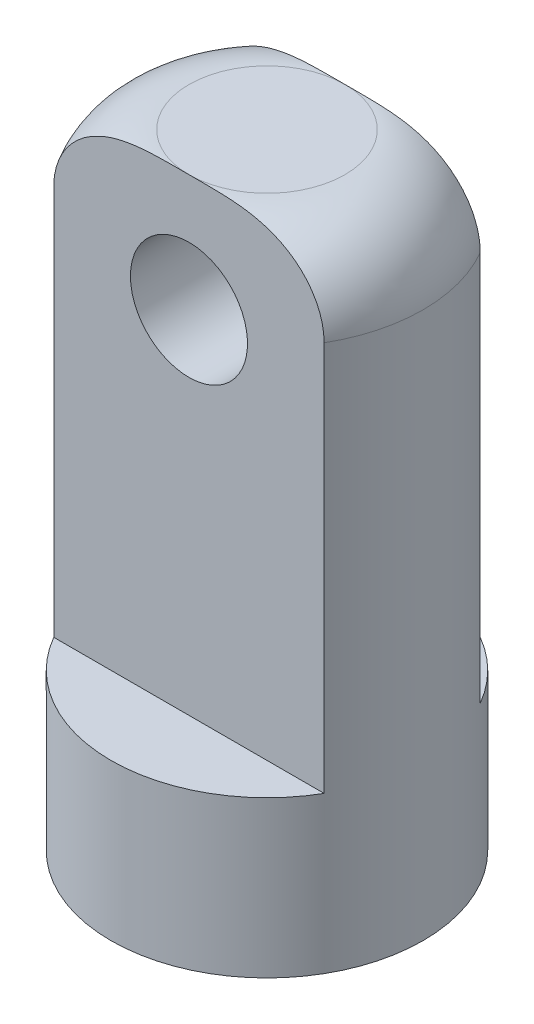
ISO-10303-21;
HEADER;
FILE_DESCRIPTION(('STEP AP214'),'2;1');
FILE_NAME('part.step','',(''),(''),'','','');
FILE_SCHEMA(('AUTOMOTIVE_DESIGN { 1 0 10303 214 1 1 1 1 }'));
ENDSEC;
DATA;
#1=APPLICATION_CONTEXT('core data for automotive mechanical design processes');
#2=APPLICATION_PROTOCOL_DEFINITION('international standard','automotive_design',2000,#1);
#3=PRODUCT_CONTEXT('',#1,'mechanical');
#4=PRODUCT('Part','Part','',(#3));
#5=PRODUCT_RELATED_PRODUCT_CATEGORY('part','',(#4));
#6=PRODUCT_DEFINITION_FORMATION('','',#4);
#7=PRODUCT_DEFINITION_CONTEXT('part definition',#1,'design');
#8=PRODUCT_DEFINITION('design','',#6,#7);
#9=PRODUCT_DEFINITION_SHAPE('','',#8);
#10=(LENGTH_UNIT() NAMED_UNIT(*) SI_UNIT(.MILLI.,.METRE.));
#11=(NAMED_UNIT(*) PLANE_ANGLE_UNIT() SI_UNIT($,.RADIAN.));
#12=(NAMED_UNIT(*) SI_UNIT($,.STERADIAN.) SOLID_ANGLE_UNIT());
#13=UNCERTAINTY_MEASURE_WITH_UNIT(LENGTH_MEASURE(1.E-05),#10,'distance_accuracy_value','');
#14=(GEOMETRIC_REPRESENTATION_CONTEXT(3) GLOBAL_UNCERTAINTY_ASSIGNED_CONTEXT((#13)) GLOBAL_UNIT_ASSIGNED_CONTEXT((#10,
#11,#12)) REPRESENTATION_CONTEXT('',''));
#15=CARTESIAN_POINT('',(0.,0.,0.));
#16=DIRECTION('',(0.,0.,1.));
#17=DIRECTION('',(1.,0.,0.));
#18=AXIS2_PLACEMENT_3D('',#15,#16,#17);
#19=CARTESIAN_POINT('',(0.,80.,0.));
#20=DIRECTION('',(0.,-1.,0.));
#21=DIRECTION('',(0.,0.,-1.));
#22=AXIS2_PLACEMENT_3D('',#19,#20,#21);
#23=CYLINDRICAL_SURFACE('',#22,20.);
#24=CARTESIAN_POINT('',(0.,0.,0.));
#25=DIRECTION('',(0.,1.,0.));
#26=DIRECTION('',(0.,0.,1.));
#27=AXIS2_PLACEMENT_3D('',#24,#25,#26);
#28=CIRCLE('',#27,20.);
#29=CARTESIAN_POINT('',(0.,0.,20.));
#30=VERTEX_POINT('',#29);
#31=EDGE_CURVE('E111',#30,#30,#28,.T.);
#32=ORIENTED_EDGE('',*,*,#31,.T.);
#33=EDGE_LOOP('',(#32));
#34=FACE_BOUND('',#33,.T.);
#35=DIRECTION('',(0.,-1.,0.));
#36=VECTOR('',#35,1.);
#37=CARTESIAN_POINT('',(17.3205080756888,80.,-10.));
#38=LINE('',#37,#36);
#39=CARTESIAN_POINT('',(17.3205080756888,70.,-10.));
#40=VERTEX_POINT('',#39);
#41=CARTESIAN_POINT('',(17.3205080756888,20.,-10.));
#42=VERTEX_POINT('',#41);
#43=EDGE_CURVE('E95',#40,#42,#38,.T.);
#44=ORIENTED_EDGE('',*,*,#43,.F.);
#45=CARTESIAN_POINT('',(0.,70.,0.));
#46=DIRECTION('',(0.,1.,0.));
#47=DIRECTION('',(0.,0.,1.));
#48=AXIS2_PLACEMENT_3D('',#45,#46,#47);
#49=CIRCLE('',#48,20.);
#50=CARTESIAN_POINT('',(17.3205080756888,70.,10.));
#51=VERTEX_POINT('',#50);
#52=EDGE_CURVE('E56',#40,#51,#49,.F.);
#53=ORIENTED_EDGE('',*,*,#52,.T.);
#54=DIRECTION('',(0.,-1.,0.));
#55=VECTOR('',#54,1.);
#56=CARTESIAN_POINT('',(17.3205080756888,80.,10.));
#57=LINE('',#56,#55);
#58=CARTESIAN_POINT('',(17.3205080756888,20.,10.));
#59=VERTEX_POINT('',#58);
#60=EDGE_CURVE('E109',#51,#59,#57,.T.);
#61=ORIENTED_EDGE('',*,*,#60,.T.);
#62=CARTESIAN_POINT('',(0.,20.,0.));
#63=DIRECTION('',(0.,-1.,0.));
#64=DIRECTION('',(0.,0.,-1.));
#65=AXIS2_PLACEMENT_3D('',#62,#63,#64);
#66=CIRCLE('',#65,20.);
#67=CARTESIAN_POINT('',(-17.3205080756888,20.,10.));
#68=VERTEX_POINT('',#67);
#69=EDGE_CURVE('E87',#59,#68,#66,.T.);
#70=ORIENTED_EDGE('',*,*,#69,.T.);
#71=DIRECTION('',(0.,-1.,0.));
#72=VECTOR('',#71,1.);
#73=CARTESIAN_POINT('',(-17.3205080756888,80.,10.));
#74=LINE('',#73,#72);
#75=CARTESIAN_POINT('',(-17.3205080756888,70.,10.));
#76=VERTEX_POINT('',#75);
#77=EDGE_CURVE('E107',#68,#76,#74,.F.);
#78=ORIENTED_EDGE('',*,*,#77,.T.);
#79=CARTESIAN_POINT('',(0.,70.,0.));
#80=DIRECTION('',(0.,1.,0.));
#81=DIRECTION('',(0.,0.,1.));
#82=AXIS2_PLACEMENT_3D('',#79,#80,#81);
#83=CIRCLE('',#82,20.);
#84=CARTESIAN_POINT('',(-17.3205080756888,70.,-10.));
#85=VERTEX_POINT('',#84);
#86=EDGE_CURVE('E99',#76,#85,#83,.F.);
#87=ORIENTED_EDGE('',*,*,#86,.T.);
#88=DIRECTION('',(0.,-1.,0.));
#89=VECTOR('',#88,1.);
#90=CARTESIAN_POINT('',(-17.3205080756888,80.,-10.));
#91=LINE('',#90,#89);
#92=CARTESIAN_POINT('',(-17.3205080756888,20.,-10.));
#93=VERTEX_POINT('',#92);
#94=EDGE_CURVE('E93',#93,#85,#91,.F.);
#95=ORIENTED_EDGE('',*,*,#94,.F.);
#96=CARTESIAN_POINT('',(0.,20.,0.));
#97=DIRECTION('',(0.,1.,0.));
#98=DIRECTION('',(0.,0.,1.));
#99=AXIS2_PLACEMENT_3D('',#96,#97,#98);
#100=CIRCLE('',#99,20.);
#101=EDGE_CURVE('E81',#42,#93,#100,.T.);
#102=ORIENTED_EDGE('',*,*,#101,.F.);
#103=EDGE_LOOP('',(#44,#53,#61,#70,#78,#87,#95,#102));
#104=FACE_BOUND('',#103,.T.);
#105=ADVANCED_FACE('F33',(#34,#104),#23,.T.);
#106=CARTESIAN_POINT('',(0.,80.,0.));
#107=DIRECTION('',(0.,1.,0.));
#108=DIRECTION('',(0.,0.,1.));
#109=AXIS2_PLACEMENT_3D('',#106,#107,#108);
#110=PLANE('',#109);
#111=CARTESIAN_POINT('',(0.,80.,0.));
#112=DIRECTION('',(0.,1.,0.));
#113=DIRECTION('',(0.,0.,1.));
#114=AXIS2_PLACEMENT_3D('',#111,#112,#113);
#115=CIRCLE('',#114,10.);
#116=CARTESIAN_POINT('',(0.,80.,-10.));
#117=VERTEX_POINT('',#116);
#118=CARTESIAN_POINT('',(0.,80.,10.));
#119=VERTEX_POINT('',#118);
#120=EDGE_CURVE('E86',#117,#119,#115,.T.);
#121=ORIENTED_EDGE('',*,*,#120,.T.);
#122=CARTESIAN_POINT('',(0.,80.,0.));
#123=DIRECTION('',(0.,1.,0.));
#124=DIRECTION('',(0.,0.,1.));
#125=AXIS2_PLACEMENT_3D('',#122,#123,#124);
#126=CIRCLE('',#125,10.);
#127=EDGE_CURVE('E118',#119,#117,#126,.T.);
#128=ORIENTED_EDGE('',*,*,#127,.T.);
#129=EDGE_LOOP('',(#121,#128));
#130=FACE_BOUND('',#129,.T.);
#131=ADVANCED_FACE('F152',(#130),#110,.T.);
#132=CARTESIAN_POINT('',(0.,0.,0.));
#133=DIRECTION('',(0.,1.,0.));
#134=DIRECTION('',(0.,0.,1.));
#135=AXIS2_PLACEMENT_3D('',#132,#133,#134);
#136=PLANE('',#135);
#137=ORIENTED_EDGE('',*,*,#31,.F.);
#138=EDGE_LOOP('',(#137));
#139=FACE_BOUND('',#138,.T.);
#140=ADVANCED_FACE('F146',(#139),#136,.F.);
#141=CARTESIAN_POINT('',(-20.,20.,30.));
#142=DIRECTION('',(0.,-1.,0.));
#143=DIRECTION('',(0.,0.,-1.));
#144=AXIS2_PLACEMENT_3D('',#141,#142,#143);
#145=PLANE('',#144);
#146=DIRECTION('',(1.,0.,0.));
#147=VECTOR('',#146,1.);
#148=CARTESIAN_POINT('',(-20.,20.,10.));
#149=LINE('',#148,#147);
#150=EDGE_CURVE('E101',#68,#59,#149,.T.);
#151=ORIENTED_EDGE('',*,*,#150,.F.);
#152=ORIENTED_EDGE('',*,*,#69,.F.);
#153=EDGE_LOOP('',(#151,#152));
#154=FACE_BOUND('',#153,.T.);
#155=ADVANCED_FACE('F141',(#154),#145,.F.);
#156=CARTESIAN_POINT('',(-20.,140.,10.));
#157=DIRECTION('',(0.,0.,-1.));
#158=DIRECTION('',(-1.,0.,0.));
#159=AXIS2_PLACEMENT_3D('',#156,#157,#158);
#160=PLANE('',#159);
#161=CARTESIAN_POINT('',(0.,65.,10.));
#162=DIRECTION('',(0.,0.,-1.));
#163=DIRECTION('',(-1.,0.,0.));
#164=AXIS2_PLACEMENT_3D('',#161,#162,#163);
#165=CIRCLE('',#164,7.50000000000001);
#166=CARTESIAN_POINT('',(-7.50000000000001,65.,10.));
#167=VERTEX_POINT('',#166);
#168=EDGE_CURVE('E96',#167,#167,#165,.T.);
#169=ORIENTED_EDGE('',*,*,#168,.T.);
#170=EDGE_LOOP('',(#169));
#171=FACE_BOUND('',#170,.T.);
#172=ORIENTED_EDGE('',*,*,#60,.F.);
#173=CARTESIAN_POINT('',(17.3205080756888,70.,10.));
#174=CARTESIAN_POINT('',(17.3205474576818,70.2495951822382,10.));
#175=CARTESIAN_POINT('',(17.30971960056,70.4991798570173,10.));
#176=CARTESIAN_POINT('',(17.2666173590729,70.9964448594755,10.));
#177=CARTESIAN_POINT('',(17.2343470121086,71.2441255367785,10.));
#178=CARTESIAN_POINT('',(17.1487647407596,71.7351221774012,10.));
#179=CARTESIAN_POINT('',(17.0955106086931,71.9784482258205,10.));
#180=CARTESIAN_POINT('',(16.9685060318072,72.4596890973419,10.));
#181=CARTESIAN_POINT('',(16.8947553276914,72.697603851946,10.));
#182=CARTESIAN_POINT('',(16.7275038919369,73.1663166164448,10.));
#183=CARTESIAN_POINT('',(16.6340078150843,73.3971162889838,10.));
#184=CARTESIAN_POINT('',(16.4281564803749,73.8501487658213,10.));
#185=CARTESIAN_POINT('',(16.315800417113,74.0723812037623,10.));
#186=CARTESIAN_POINT('',(16.0732748310619,74.5069272193091,10.));
#187=CARTESIAN_POINT('',(15.9431032043204,74.7192396214169,10.));
#188=CARTESIAN_POINT('',(15.6661419395567,75.1327224852159,10.));
#189=CARTESIAN_POINT('',(15.5193520518466,75.3338927794304,10.));
#190=CARTESIAN_POINT('',(15.2060751380924,75.7295918862541,10.));
#191=CARTESIAN_POINT('',(15.0391489951897,75.9237728143516,10.));
#192=CARTESIAN_POINT('',(14.6905607989416,76.2984042114967,10.));
#193=CARTESIAN_POINT('',(14.5088985463004,76.4788544947828,10.));
#194=CARTESIAN_POINT('',(14.132275066344,76.8254497727554,10.));
#195=CARTESIAN_POINT('',(13.9373079819944,76.9915883934209,10.));
#196=CARTESIAN_POINT('',(13.5356649772152,77.3090635728592,10.));
#197=CARTESIAN_POINT('',(13.3289877444388,77.4603984673883,10.));
#198=CARTESIAN_POINT('',(12.8838877253066,77.762699678455,10.));
#199=CARTESIAN_POINT('',(12.6443748879999,77.9120607556282,10.));
#200=CARTESIAN_POINT('',(12.1549491818966,78.1926024134809,10.));
#201=CARTESIAN_POINT('',(11.9050357238729,78.3237819622931,10.));
#202=CARTESIAN_POINT('',(11.3969333055066,78.5681854447997,10.));
#203=CARTESIAN_POINT('',(11.1387533621984,78.6814281921691,10.));
#204=CARTESIAN_POINT('',(10.6155454876831,78.8907744045587,10.));
#205=CARTESIAN_POINT('',(10.3505171385723,78.9868768208,10.));
#206=CARTESIAN_POINT('',(9.8456702460404,79.1528070110022,10.));
#207=CARTESIAN_POINT('',(9.60642120509603,79.2243810370654,10.));
#208=CARTESIAN_POINT('',(9.12465250987233,79.3555771982043,10.));
#209=CARTESIAN_POINT('',(8.88213234839825,79.4151974565464,10.));
#210=CARTESIAN_POINT('',(8.15066859973067,79.577501548388,10.));
#211=CARTESIAN_POINT('',(7.65800264738304,79.6635709580236,10.));
#212=CARTESIAN_POINT('',(6.66471554991749,79.8003366494078,10.));
#213=CARTESIAN_POINT('',(6.16406311982536,79.8507892641862,10.));
#214=CARTESIAN_POINT('',(5.16101225143119,79.925374238085,10.));
#215=CARTESIAN_POINT('',(4.65861401380123,79.9495095279997,10.));
#216=CARTESIAN_POINT('',(3.80752676377934,79.9766866797706,10.));
#217=CARTESIAN_POINT('',(3.45894074020613,79.9839271063831,10.));
#218=CARTESIAN_POINT('',(2.76173716810991,79.9937304925709,10.));
#219=CARTESIAN_POINT('',(2.41311962509923,79.9962938656522,10.));
#220=CARTESIAN_POINT('',(1.89245902908406,79.9985076322786,10.));
#221=CARTESIAN_POINT('',(1.72041640343144,79.9989758369582,10.));
#222=CARTESIAN_POINT('',(1.37633050040958,79.9996041299525,10.));
#223=CARTESIAN_POINT('',(1.20428722304167,79.9997642187195,10.));
#224=CARTESIAN_POINT('',(0.860203261159728,79.9999534428038,10.));
#225=CARTESIAN_POINT('',(0.688162576644538,79.9999825800343,10.));
#226=CARTESIAN_POINT('',(0.344081276500678,79.9999997037263,10.));
#227=CARTESIAN_POINT('',(0.172040660872011,79.9999876902057,10.));
#228=CARTESIAN_POINT('',(0.,80.,10.));
#229=B_SPLINE_CURVE_WITH_KNOTS('',3,(#173,#174,#175,#176,#177,#178,#179,#180,#181,#182,#183,
#184,#185,#186,#187,#188,#189,#190,#191,#192,#193,#194,#195,#196,#197,#198,#199,#200,#201,#202,
#203,#204,#205,#206,#207,#208,#209,#210,#211,#212,#213,#214,#215,#216,#217,#218,#219,#220,#221,
#222,#223,#224,#225,#226,#227,#228),.UNSPECIFIED.,.F.,.F.,(4,2,2,2,2,2,2,2,2,2,2,2,2,2,2,2,2,2,
2,2,2,2,2,2,2,2,2,4),(0.,0.748534773100205,1.49692864470017,2.24327558095096,2.98963195945499,
3.73581258746373,4.48202508881166,5.22832579126901,5.97463770831596,6.74202117259057,
7.50941501692659,8.27714888914716,9.04496897151072,9.89093831975247,10.7369556601655,
11.58207966233,12.4272553580364,13.1761023422636,13.9250668030654,15.4235630891663,
16.932214287212,18.4406974591398,19.4866502344462,20.5325105308722,21.0486409425348,
21.564770596329,22.0808927092633,22.5970145986548),.UNSPECIFIED.);
#230=EDGE_CURVE('E11',#51,#119,#229,.T.);
#231=ORIENTED_EDGE('',*,*,#230,.T.);
#232=CARTESIAN_POINT('',(0.,80.,10.));
#233=CARTESIAN_POINT('',(-0.204835793896703,79.9999754054481,10.));
#234=CARTESIAN_POINT('',(-0.409671524686448,79.9999994306293,10.));
#235=CARTESIAN_POINT('',(-0.819343965771329,79.9999649873489,10.));
#236=CARTESIAN_POINT('',(-1.02418067606637,79.9999065184851,10.));
#237=CARTESIAN_POINT('',(-1.43392567715637,79.9995272845722,10.));
#238=CARTESIAN_POINT('',(-1.63883396798211,79.9992064279833,10.));
#239=CARTESIAN_POINT('',(-2.04864830608355,79.9979525059261,10.));
#240=CARTESIAN_POINT('',(-2.25355435335833,79.9970194402169,10.));
#241=CARTESIAN_POINT('',(-2.87427748016541,79.9926156927024,10.));
#242=CARTESIAN_POINT('',(-3.29008916251106,79.987521567528,10.));
#243=CARTESIAN_POINT('',(-4.12150319180789,79.9682650316135,10.));
#244=CARTESIAN_POINT('',(-4.53710555384003,79.9541034109161,10.));
#245=CARTESIAN_POINT('',(-5.38063379502646,79.9104129273415,10.));
#246=CARTESIAN_POINT('',(-5.80853776182632,79.8804164399379,10.));
#247=CARTESIAN_POINT('',(-6.662411277602,79.7984600293883,10.));
#248=CARTESIAN_POINT('',(-7.08838054900704,79.7464970494228,10.));
#249=CARTESIAN_POINT('',(-7.93341804143618,79.6150364687331,10.));
#250=CARTESIAN_POINT('',(-8.35251283357489,79.5357144209128,10.));
#251=CARTESIAN_POINT('',(-9.18305431905883,79.3443239839151,10.));
#252=CARTESIAN_POINT('',(-9.59450611435745,79.2322783404163,10.));
#253=CARTESIAN_POINT('',(-10.2732079302621,79.0138834830689,10.));
#254=CARTESIAN_POINT('',(-10.5437112053955,78.9176007742016,10.));
#255=CARTESIAN_POINT('',(-11.0779841769494,78.7072354691133,10.));
#256=CARTESIAN_POINT('',(-11.3417487913182,78.59313987483,10.));
#257=CARTESIAN_POINT('',(-11.8589460777963,78.3472542798509,10.));
#258=CARTESIAN_POINT('',(-12.1124321468201,78.2155769621301,10.));
#259=CARTESIAN_POINT('',(-12.6088149416355,77.9336361454482,10.));
#260=CARTESIAN_POINT('',(-12.8517138149861,77.7833764397831,10.));
#261=CARTESIAN_POINT('',(-13.3270426946741,77.4627689621282,10.));
#262=CARTESIAN_POINT('',(-13.5593611562273,77.2922553318989,10.));
#263=CARTESIAN_POINT('',(-14.0090671544983,76.9324900199751,10.));
#264=CARTESIAN_POINT('',(-14.2264536910005,76.7432370850969,10.));
#265=CARTESIAN_POINT('',(-14.6444467784352,76.346312423191,10.));
#266=CARTESIAN_POINT('',(-14.8450242069556,76.1386099634349,10.));
#267=CARTESIAN_POINT('',(-15.2268084867595,75.7060936804275,10.));
#268=CARTESIAN_POINT('',(-15.4080163789392,75.4812807777841,10.));
#269=CARTESIAN_POINT('',(-15.7460006494705,75.0200121429316,10.));
#270=CARTESIAN_POINT('',(-15.9031501088045,74.7838301154795,10.));
#271=CARTESIAN_POINT('',(-16.1949461829115,74.2979122616008,10.));
#272=CARTESIAN_POINT('',(-16.3295912489097,74.0481755038897,10.));
#273=CARTESIAN_POINT('',(-16.5745828809241,73.5374104165288,10.));
#274=CARTESIAN_POINT('',(-16.6849596618695,73.2763966175109,10.));
#275=CARTESIAN_POINT('',(-16.8802164271464,72.7451383513172,10.));
#276=CARTESIAN_POINT('',(-16.9651046281892,72.4748968902027,10.));
#277=CARTESIAN_POINT('',(-17.1306019419192,71.8422631491627,10.));
#278=CARTESIAN_POINT('',(-17.2017022446935,71.4773068570131,10.));
#279=CARTESIAN_POINT('',(-17.272915238543,70.9256237667173,10.));
#280=CARTESIAN_POINT('',(-17.2907466699786,70.7410032941452,10.));
#281=CARTESIAN_POINT('',(-17.3145447933456,70.3709422461373,10.));
#282=CARTESIAN_POINT('',(-17.3205078314448,70.1855014357546,10.));
#283=CARTESIAN_POINT('',(-17.3205080756888,70.,10.));
#284=B_SPLINE_CURVE_WITH_KNOTS('',3,(#232,#233,#234,#235,#236,#237,#238,#239,#240,#241,#242,
#243,#244,#245,#246,#247,#248,#249,#250,#251,#252,#253,#254,#255,#256,#257,#258,#259,#260,#261,
#262,#263,#264,#265,#266,#267,#268,#269,#270,#271,#272,#273,#274,#275,#276,#277,#278,#279,#280,
#281,#282,#283),.UNSPECIFIED.,.F.,.F.,(4,2,2,2,2,2,2,2,2,2,2,2,2,2,2,2,2,2,2,2,2,2,2,2,2,4),(0.,
0.614507246233736,1.22901748798402,1.84374220658056,2.4584671671909,3.70594797353434,
4.95332010277211,6.23977838238188,7.52641574229623,8.80494626524928,10.0825902073851,
10.9434230569104,11.8048870176392,12.6610734120861,13.5170853174415,14.3806654419352,
15.2443033570714,16.1094078884626,16.9744659067474,17.8243363929903,18.6742653441046,
19.5231300329285,20.3717207801209,21.4837402901806,22.0398572640864,22.5961454190319),.UNSPECIFIED.);
#285=EDGE_CURVE('E43',#119,#76,#284,.T.);
#286=ORIENTED_EDGE('',*,*,#285,.T.);
#287=ORIENTED_EDGE('',*,*,#77,.F.);
#288=ORIENTED_EDGE('',*,*,#150,.T.);
#289=EDGE_LOOP('',(#172,#231,#286,#287,#288));
#290=FACE_BOUND('',#289,.T.);
#291=ADVANCED_FACE('F145',(#171,#290),#160,.F.);
#292=CARTESIAN_POINT('',(-20.,20.,-30.));
#293=DIRECTION('',(0.,1.,0.));
#294=DIRECTION('',(0.,0.,1.));
#295=AXIS2_PLACEMENT_3D('',#292,#293,#294);
#296=PLANE('',#295);
#297=ORIENTED_EDGE('',*,*,#101,.T.);
#298=DIRECTION('',(1.,0.,0.));
#299=VECTOR('',#298,1.);
#300=CARTESIAN_POINT('',(-20.,20.,-10.));
#301=LINE('',#300,#299);
#302=EDGE_CURVE('E84',#93,#42,#301,.T.);
#303=ORIENTED_EDGE('',*,*,#302,.T.);
#304=EDGE_LOOP('',(#297,#303));
#305=FACE_BOUND('',#304,.T.);
#306=ADVANCED_FACE('F83',(#305),#296,.T.);
#307=CARTESIAN_POINT('',(-20.,140.,-10.));
#308=DIRECTION('',(0.,0.,-1.));
#309=DIRECTION('',(-1.,0.,0.));
#310=AXIS2_PLACEMENT_3D('',#307,#308,#309);
#311=PLANE('',#310);
#312=CARTESIAN_POINT('',(0.,65.,-10.));
#313=DIRECTION('',(0.,0.,-1.));
#314=DIRECTION('',(-1.,0.,0.));
#315=AXIS2_PLACEMENT_3D('',#312,#313,#314);
#316=CIRCLE('',#315,7.50000000000001);
#317=CARTESIAN_POINT('',(-7.50000000000001,65.,-10.));
#318=VERTEX_POINT('',#317);
#319=EDGE_CURVE('E38',#318,#318,#316,.T.);
#320=ORIENTED_EDGE('',*,*,#319,.F.);
#321=EDGE_LOOP('',(#320));
#322=FACE_BOUND('',#321,.T.);
#323=CARTESIAN_POINT('',(-17.3205080756888,70.,-10.));
#324=CARTESIAN_POINT('',(-17.3205474576818,70.2495951822382,-10.));
#325=CARTESIAN_POINT('',(-17.30971960056,70.4991798570173,-10.));
#326=CARTESIAN_POINT('',(-17.2666173590729,70.9964448594755,-10.));
#327=CARTESIAN_POINT('',(-17.2343470121086,71.2441255367785,-10.));
#328=CARTESIAN_POINT('',(-17.1487647407596,71.7351221774012,-10.));
#329=CARTESIAN_POINT('',(-17.0955106086931,71.9784482258205,-10.));
#330=CARTESIAN_POINT('',(-16.9685060318072,72.4596890973419,-10.));
#331=CARTESIAN_POINT('',(-16.8947553276914,72.697603851946,-10.));
#332=CARTESIAN_POINT('',(-16.7275038919369,73.1663166164448,-10.));
#333=CARTESIAN_POINT('',(-16.6340078150843,73.3971162889838,-10.));
#334=CARTESIAN_POINT('',(-16.4281564803749,73.8501487658213,-10.));
#335=CARTESIAN_POINT('',(-16.315800417113,74.0723812037623,-10.));
#336=CARTESIAN_POINT('',(-16.0732748310619,74.5069272193091,-10.));
#337=CARTESIAN_POINT('',(-15.9431032043204,74.7192396214169,-10.));
#338=CARTESIAN_POINT('',(-15.6661419395567,75.1327224852159,-10.));
#339=CARTESIAN_POINT('',(-15.5193520518466,75.3338927794304,-10.));
#340=CARTESIAN_POINT('',(-15.2060751380924,75.7295918862541,-10.));
#341=CARTESIAN_POINT('',(-15.0391489951897,75.9237728143516,-10.));
#342=CARTESIAN_POINT('',(-14.6905607989416,76.2984042114967,-10.));
#343=CARTESIAN_POINT('',(-14.5088985463004,76.4788544947828,-10.));
#344=CARTESIAN_POINT('',(-14.132275066344,76.8254497727554,-10.));
#345=CARTESIAN_POINT('',(-13.9373079819944,76.9915883934209,-10.));
#346=CARTESIAN_POINT('',(-13.5356649772152,77.3090635728592,-10.));
#347=CARTESIAN_POINT('',(-13.3289877444388,77.4603984673883,-10.));
#348=CARTESIAN_POINT('',(-12.8838877253066,77.762699678455,-10.));
#349=CARTESIAN_POINT('',(-12.6443748879999,77.9120607556282,-10.));
#350=CARTESIAN_POINT('',(-12.1549491818966,78.1926024134809,-10.));
#351=CARTESIAN_POINT('',(-11.9050357238729,78.3237819622931,-10.));
#352=CARTESIAN_POINT('',(-11.3969333055066,78.5681854447997,-10.));
#353=CARTESIAN_POINT('',(-11.1387533621984,78.6814281921691,-10.));
#354=CARTESIAN_POINT('',(-10.6155454876831,78.8907744045587,-10.));
#355=CARTESIAN_POINT('',(-10.3505171385723,78.9868768208,-10.));
#356=CARTESIAN_POINT('',(-9.8456702460404,79.1528070110022,-10.));
#357=CARTESIAN_POINT('',(-9.60642120509603,79.2243810370654,-10.));
#358=CARTESIAN_POINT('',(-9.12465250987233,79.3555771982043,-10.));
#359=CARTESIAN_POINT('',(-8.88213234839825,79.4151974565464,-10.));
#360=CARTESIAN_POINT('',(-8.15066859973067,79.577501548388,-10.));
#361=CARTESIAN_POINT('',(-7.65800264738304,79.6635709580236,-10.));
#362=CARTESIAN_POINT('',(-6.66471554991749,79.8003366494078,-10.));
#363=CARTESIAN_POINT('',(-6.16406311982536,79.8507892641862,-10.));
#364=CARTESIAN_POINT('',(-5.16101225143119,79.925374238085,-10.));
#365=CARTESIAN_POINT('',(-4.65861401380123,79.9495095279997,-10.));
#366=CARTESIAN_POINT('',(-3.80752676377934,79.9766866797706,-10.));
#367=CARTESIAN_POINT('',(-3.45894074020613,79.9839271063831,-10.));
#368=CARTESIAN_POINT('',(-2.76173716810991,79.9937304925709,-10.));
#369=CARTESIAN_POINT('',(-2.41311962509923,79.9962938656522,-10.));
#370=CARTESIAN_POINT('',(-1.89245902908406,79.9985076322786,-10.));
#371=CARTESIAN_POINT('',(-1.72041640343144,79.9989758369582,-10.));
#372=CARTESIAN_POINT('',(-1.37633050040958,79.9996041299525,-10.));
#373=CARTESIAN_POINT('',(-1.20428722304167,79.9997642187195,-10.));
#374=CARTESIAN_POINT('',(-0.860203261159728,79.9999534428038,-10.));
#375=CARTESIAN_POINT('',(-0.688162576644538,79.9999825800343,-10.));
#376=CARTESIAN_POINT('',(-0.344081276500678,79.9999997037263,-10.));
#377=CARTESIAN_POINT('',(-0.172040660872011,79.9999876902057,-10.));
#378=CARTESIAN_POINT('',(0.,80.,-10.));
#379=B_SPLINE_CURVE_WITH_KNOTS('',3,(#323,#324,#325,#326,#327,#328,#329,#330,#331,#332,#333,
#334,#335,#336,#337,#338,#339,#340,#341,#342,#343,#344,#345,#346,#347,#348,#349,#350,#351,#352,
#353,#354,#355,#356,#357,#358,#359,#360,#361,#362,#363,#364,#365,#366,#367,#368,#369,#370,#371,
#372,#373,#374,#375,#376,#377,#378),.UNSPECIFIED.,.F.,.F.,(4,2,2,2,2,2,2,2,2,2,2,2,2,2,2,2,2,2,
2,2,2,2,2,2,2,2,2,4),(0.,0.748534773100205,1.49692864470017,2.24327558095096,2.98963195945499,
3.73581258746373,4.48202508881166,5.22832579126901,5.97463770831596,6.74202117259057,
7.50941501692659,8.27714888914716,9.04496897151072,9.89093831975247,10.7369556601655,
11.58207966233,12.4272553580364,13.1761023422636,13.9250668030654,15.4235630891663,
16.932214287212,18.4406974591398,19.4866502344462,20.5325105308722,21.0486409425348,
21.564770596329,22.0808927092633,22.5970145986548),.UNSPECIFIED.);
#380=EDGE_CURVE('E121',#85,#117,#379,.T.);
#381=ORIENTED_EDGE('',*,*,#380,.T.);
#382=CARTESIAN_POINT('',(0.,80.,-10.));
#383=CARTESIAN_POINT('',(0.204835793896703,79.9999754054481,-10.));
#384=CARTESIAN_POINT('',(0.409671524686448,79.9999994306293,-10.));
#385=CARTESIAN_POINT('',(0.819343965771329,79.9999649873489,-10.));
#386=CARTESIAN_POINT('',(1.02418067606637,79.9999065184851,-10.));
#387=CARTESIAN_POINT('',(1.43392567715637,79.9995272845722,-10.));
#388=CARTESIAN_POINT('',(1.63883396798211,79.9992064279833,-10.));
#389=CARTESIAN_POINT('',(2.04864830608355,79.9979525059261,-10.));
#390=CARTESIAN_POINT('',(2.25355435335833,79.9970194402169,-10.));
#391=CARTESIAN_POINT('',(2.87427748016541,79.9926156927024,-10.));
#392=CARTESIAN_POINT('',(3.29008916251106,79.987521567528,-10.));
#393=CARTESIAN_POINT('',(4.12150319180789,79.9682650316135,-10.));
#394=CARTESIAN_POINT('',(4.53710555384003,79.9541034109161,-10.));
#395=CARTESIAN_POINT('',(5.38063379502646,79.9104129273415,-10.));
#396=CARTESIAN_POINT('',(5.80853776182632,79.8804164399379,-10.));
#397=CARTESIAN_POINT('',(6.662411277602,79.7984600293883,-10.));
#398=CARTESIAN_POINT('',(7.08838054900704,79.7464970494228,-10.));
#399=CARTESIAN_POINT('',(7.93341804143618,79.6150364687331,-10.));
#400=CARTESIAN_POINT('',(8.35251283357489,79.5357144209128,-10.));
#401=CARTESIAN_POINT('',(9.18305431905883,79.3443239839151,-10.));
#402=CARTESIAN_POINT('',(9.59450611435745,79.2322783404163,-10.));
#403=CARTESIAN_POINT('',(10.2732079302621,79.0138834830689,-10.));
#404=CARTESIAN_POINT('',(10.5437112053955,78.9176007742016,-10.));
#405=CARTESIAN_POINT('',(11.0779841769494,78.7072354691133,-10.));
#406=CARTESIAN_POINT('',(11.3417487913182,78.59313987483,-10.));
#407=CARTESIAN_POINT('',(11.8589460777963,78.3472542798509,-10.));
#408=CARTESIAN_POINT('',(12.1124321468201,78.2155769621301,-10.));
#409=CARTESIAN_POINT('',(12.6088149416355,77.9336361454482,-10.));
#410=CARTESIAN_POINT('',(12.8517138149861,77.7833764397831,-10.));
#411=CARTESIAN_POINT('',(13.3270426946741,77.4627689621282,-10.));
#412=CARTESIAN_POINT('',(13.5593611562273,77.2922553318989,-10.));
#413=CARTESIAN_POINT('',(14.0090671544983,76.9324900199751,-10.));
#414=CARTESIAN_POINT('',(14.2264536910005,76.7432370850969,-10.));
#415=CARTESIAN_POINT('',(14.6444467784352,76.346312423191,-10.));
#416=CARTESIAN_POINT('',(14.8450242069556,76.1386099634349,-10.));
#417=CARTESIAN_POINT('',(15.2268084867595,75.7060936804275,-10.));
#418=CARTESIAN_POINT('',(15.4080163789392,75.4812807777841,-10.));
#419=CARTESIAN_POINT('',(15.7460006494705,75.0200121429316,-10.));
#420=CARTESIAN_POINT('',(15.9031501088045,74.7838301154795,-10.));
#421=CARTESIAN_POINT('',(16.1949461829115,74.2979122616008,-10.));
#422=CARTESIAN_POINT('',(16.3295912489097,74.0481755038897,-10.));
#423=CARTESIAN_POINT('',(16.5745828809241,73.5374104165288,-10.));
#424=CARTESIAN_POINT('',(16.6849596618695,73.2763966175109,-10.));
#425=CARTESIAN_POINT('',(16.8802164271464,72.7451383513172,-10.));
#426=CARTESIAN_POINT('',(16.9651046281892,72.4748968902027,-10.));
#427=CARTESIAN_POINT('',(17.1306019419192,71.8422631491627,-10.));
#428=CARTESIAN_POINT('',(17.2017022446935,71.4773068570131,-10.));
#429=CARTESIAN_POINT('',(17.272915238543,70.9256237667173,-10.));
#430=CARTESIAN_POINT('',(17.2907466699786,70.7410032941452,-10.));
#431=CARTESIAN_POINT('',(17.3145447933456,70.3709422461373,-10.));
#432=CARTESIAN_POINT('',(17.3205078314448,70.1855014357546,-10.));
#433=CARTESIAN_POINT('',(17.3205080756888,70.,-10.));
#434=B_SPLINE_CURVE_WITH_KNOTS('',3,(#382,#383,#384,#385,#386,#387,#388,#389,#390,#391,#392,
#393,#394,#395,#396,#397,#398,#399,#400,#401,#402,#403,#404,#405,#406,#407,#408,#409,#410,#411,
#412,#413,#414,#415,#416,#417,#418,#419,#420,#421,#422,#423,#424,#425,#426,#427,#428,#429,#430,
#431,#432,#433),.UNSPECIFIED.,.F.,.F.,(4,2,2,2,2,2,2,2,2,2,2,2,2,2,2,2,2,2,2,2,2,2,2,2,2,4),(0.,
0.614507246233736,1.22901748798402,1.84374220658056,2.4584671671909,3.70594797353434,
4.95332010277211,6.23977838238188,7.52641574229623,8.80494626524928,10.0825902073851,
10.9434230569104,11.8048870176392,12.6610734120861,13.5170853174415,14.3806654419352,
15.2443033570714,16.1094078884626,16.9744659067474,17.8243363929903,18.6742653441046,
19.5231300329285,20.3717207801209,21.4837402901806,22.0398572640864,22.5961454190319),.UNSPECIFIED.);
#435=EDGE_CURVE('E128',#117,#40,#434,.T.);
#436=ORIENTED_EDGE('',*,*,#435,.T.);
#437=ORIENTED_EDGE('',*,*,#43,.T.);
#438=ORIENTED_EDGE('',*,*,#302,.F.);
#439=ORIENTED_EDGE('',*,*,#94,.T.);
#440=EDGE_LOOP('',(#381,#436,#437,#438,#439));
#441=FACE_BOUND('',#440,.T.);
#442=ADVANCED_FACE('F92',(#322,#441),#311,.T.);
#443=CARTESIAN_POINT('',(0.,70.,0.));
#444=DIRECTION('',(0.,1.,0.));
#445=DIRECTION('',(0.,0.,1.));
#446=AXIS2_PLACEMENT_3D('',#443,#444,#445);
#447=DEGENERATE_TOROIDAL_SURFACE('',#446,10.,10.,.T.);
#448=ORIENTED_EDGE('',*,*,#230,.F.);
#449=ORIENTED_EDGE('',*,*,#52,.F.);
#450=ORIENTED_EDGE('',*,*,#435,.F.);
#451=ORIENTED_EDGE('',*,*,#127,.F.);
#452=EDGE_LOOP('',(#448,#449,#450,#451));
#453=FACE_BOUND('',#452,.T.);
#454=ADVANCED_FACE('F138',(#453),#447,.T.);
#455=CARTESIAN_POINT('',(0.,70.,0.));
#456=DIRECTION('',(0.,1.,0.));
#457=DIRECTION('',(0.,0.,1.));
#458=AXIS2_PLACEMENT_3D('',#455,#456,#457);
#459=DEGENERATE_TOROIDAL_SURFACE('',#458,10.,10.,.T.);
#460=ORIENTED_EDGE('',*,*,#380,.F.);
#461=ORIENTED_EDGE('',*,*,#86,.F.);
#462=ORIENTED_EDGE('',*,*,#285,.F.);
#463=ORIENTED_EDGE('',*,*,#120,.F.);
#464=EDGE_LOOP('',(#460,#461,#462,#463));
#465=FACE_BOUND('',#464,.T.);
#466=ADVANCED_FACE('F35',(#465),#459,.T.);
#467=CARTESIAN_POINT('',(0.,65.,-20.));
#468=DIRECTION('',(0.,0.,1.));
#469=DIRECTION('',(1.,0.,0.));
#470=AXIS2_PLACEMENT_3D('',#467,#468,#469);
#471=CYLINDRICAL_SURFACE('',#470,7.50000000000001);
#472=ORIENTED_EDGE('',*,*,#319,.T.);
#473=EDGE_LOOP('',(#472));
#474=FACE_BOUND('',#473,.T.);
#475=ORIENTED_EDGE('',*,*,#168,.F.);
#476=EDGE_LOOP('',(#475));
#477=FACE_BOUND('',#476,.T.);
#478=ADVANCED_FACE('F188',(#474,#477),#471,.F.);
#479=CLOSED_SHELL('',(#105,#131,#140,#155,#291,#306,#442,#454,#466,#478));
#480=MANIFOLD_SOLID_BREP('B2',#479);
#481=ADVANCED_BREP_SHAPE_REPRESENTATION('',(#18,#480),#14);
#482=SHAPE_DEFINITION_REPRESENTATION(#9,#481);
ENDSEC;
END-ISO-10303-21;
